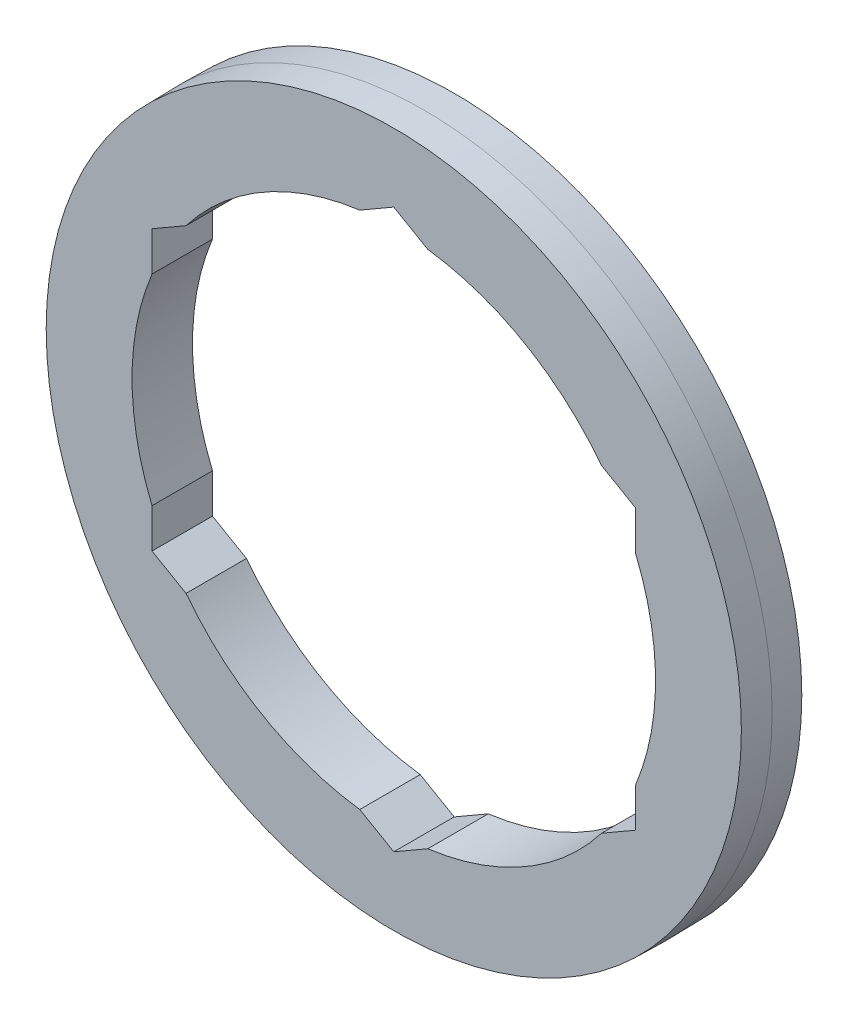
ISO-10303-21;
HEADER;
FILE_DESCRIPTION(('STEP AP214'),'2;1');
FILE_NAME('part.step','',(''),(''),'','','');
FILE_SCHEMA(('AUTOMOTIVE_DESIGN { 1 0 10303 214 1 1 1 1 }'));
ENDSEC;
DATA;
#1=APPLICATION_CONTEXT('core data for automotive mechanical design processes');
#2=APPLICATION_PROTOCOL_DEFINITION('international standard','automotive_design',2000,#1);
#3=PRODUCT_CONTEXT('',#1,'mechanical');
#4=PRODUCT('Part','Part','',(#3));
#5=PRODUCT_RELATED_PRODUCT_CATEGORY('part','',(#4));
#6=PRODUCT_DEFINITION_FORMATION('','',#4);
#7=PRODUCT_DEFINITION_CONTEXT('part definition',#1,'design');
#8=PRODUCT_DEFINITION('design','',#6,#7);
#9=PRODUCT_DEFINITION_SHAPE('','',#8);
#10=(LENGTH_UNIT() NAMED_UNIT(*) SI_UNIT(.MILLI.,.METRE.));
#11=(NAMED_UNIT(*) PLANE_ANGLE_UNIT() SI_UNIT($,.RADIAN.));
#12=(NAMED_UNIT(*) SI_UNIT($,.STERADIAN.) SOLID_ANGLE_UNIT());
#13=UNCERTAINTY_MEASURE_WITH_UNIT(LENGTH_MEASURE(1.E-05),#10,'distance_accuracy_value','');
#14=(GEOMETRIC_REPRESENTATION_CONTEXT(3) GLOBAL_UNCERTAINTY_ASSIGNED_CONTEXT((#13)) GLOBAL_UNIT_ASSIGNED_CONTEXT((#10,
#11,#12)) REPRESENTATION_CONTEXT('',''));
#15=CARTESIAN_POINT('',(0.,0.,0.));
#16=DIRECTION('',(0.,0.,1.));
#17=DIRECTION('',(1.,0.,0.));
#18=AXIS2_PLACEMENT_3D('',#15,#16,#17);
#19=CARTESIAN_POINT('',(0.,0.,-0.79375));
#20=DIRECTION('',(0.,0.,1.));
#21=DIRECTION('',(1.,0.,0.));
#22=AXIS2_PLACEMENT_3D('',#19,#20,#21);
#23=PLANE('',#22);
#24=CARTESIAN_POINT('',(0.,0.,-0.793750000000037));
#25=DIRECTION('',(0.,0.,1.));
#26=DIRECTION('',(1.,0.,0.));
#27=AXIS2_PLACEMENT_3D('',#24,#25,#26);
#28=CIRCLE('',#27,9.13014504221323);
#29=CARTESIAN_POINT('',(9.13014504221323,0.,-0.793750000000037));
#30=VERTEX_POINT('',#29);
#31=EDGE_CURVE('E20',#30,#30,#28,.T.);
#32=ORIENTED_EDGE('',*,*,#31,.F.);
#33=EDGE_LOOP('',(#32));
#34=FACE_BOUND('',#33,.T.);
#35=DIRECTION('',(0.866025403784439,-0.499999999999999,0.));
#36=VECTOR('',#35,1.);
#37=CARTESIAN_POINT('',(0.,7.33234841870825,-0.79375));
#38=LINE('',#37,#36);
#39=CARTESIAN_POINT('',(0.,7.33234841870825,-0.79375));
#40=VERTEX_POINT('',#39);
#41=CARTESIAN_POINT('',(0.893039571032189,6.81675178197583,-0.79375));
#42=VERTEX_POINT('',#41);
#43=EDGE_CURVE('E197',#40,#42,#38,.T.);
#44=ORIENTED_EDGE('',*,*,#43,.F.);
#45=DIRECTION('',(0.866025403784439,0.499999999999999,0.));
#46=VECTOR('',#45,1.);
#47=CARTESIAN_POINT('',(-0.893039571032188,6.81675178197583,-0.79375));
#48=LINE('',#47,#46);
#49=CARTESIAN_POINT('',(-0.89303957103219,6.81675178197583,-0.79375));
#50=VERTEX_POINT('',#49);
#51=EDGE_CURVE('E201',#50,#40,#48,.T.);
#52=ORIENTED_EDGE('',*,*,#51,.F.);
#53=CARTESIAN_POINT('',(0.,0.,-0.79375));
#54=DIRECTION('',(0.,0.,-1.));
#55=DIRECTION('',(-1.,0.,0.));
#56=AXIS2_PLACEMENT_3D('',#53,#54,#55);
#57=CIRCLE('',#56,6.874999966);
#58=CARTESIAN_POINT('',(-5.45696042896781,4.18177084608655,-0.79375));
#59=VERTEX_POINT('',#58);
#60=EDGE_CURVE('E291',#50,#59,#57,.F.);
#61=ORIENTED_EDGE('',*,*,#60,.T.);
#62=DIRECTION('',(0.866025403784439,0.5,0.));
#63=VECTOR('',#62,1.);
#64=CARTESIAN_POINT('',(-3.175,5.49926131403119,-0.79375));
#65=LINE('',#64,#63);
#66=CARTESIAN_POINT('',(-6.35,3.66617420935413,-0.79375));
#67=VERTEX_POINT('',#66);
#68=EDGE_CURVE('E208',#67,#59,#65,.T.);
#69=ORIENTED_EDGE('',*,*,#68,.F.);
#70=DIRECTION('',(0.,1.,0.));
#71=VECTOR('',#70,1.);
#72=CARTESIAN_POINT('',(-6.35,0.,-0.79375));
#73=LINE('',#72,#71);
#74=CARTESIAN_POINT('',(-6.35,2.63498093588928,-0.79375));
#75=VERTEX_POINT('',#74);
#76=EDGE_CURVE('E214',#75,#67,#73,.T.);
#77=ORIENTED_EDGE('',*,*,#76,.F.);
#78=CARTESIAN_POINT('',(0.,0.,-0.79375));
#79=DIRECTION('',(0.,0.,-1.));
#80=DIRECTION('',(-1.,0.,0.));
#81=AXIS2_PLACEMENT_3D('',#78,#79,#80);
#82=CIRCLE('',#81,6.874999966);
#83=CARTESIAN_POINT('',(-6.35,-2.63498093588928,-0.79375));
#84=VERTEX_POINT('',#83);
#85=EDGE_CURVE('E217',#75,#84,#82,.F.);
#86=ORIENTED_EDGE('',*,*,#85,.T.);
#87=DIRECTION('',(0.,1.,0.));
#88=VECTOR('',#87,1.);
#89=CARTESIAN_POINT('',(-6.35,0.,-0.79375));
#90=LINE('',#89,#88);
#91=CARTESIAN_POINT('',(-6.35,-3.66617420935412,-0.79375));
#92=VERTEX_POINT('',#91);
#93=EDGE_CURVE('E220',#92,#84,#90,.T.);
#94=ORIENTED_EDGE('',*,*,#93,.F.);
#95=DIRECTION('',(-0.866025403784439,0.5,0.));
#96=VECTOR('',#95,1.);
#97=CARTESIAN_POINT('',(-3.175,-5.49926131403119,-0.79375));
#98=LINE('',#97,#96);
#99=CARTESIAN_POINT('',(-5.45696042896782,-4.18177084608654,-0.79375));
#100=VERTEX_POINT('',#99);
#101=EDGE_CURVE('E227',#100,#92,#98,.T.);
#102=ORIENTED_EDGE('',*,*,#101,.F.);
#103=CARTESIAN_POINT('',(0.,0.,-0.79375));
#104=DIRECTION('',(0.,0.,-1.));
#105=DIRECTION('',(-1.,0.,0.));
#106=AXIS2_PLACEMENT_3D('',#103,#104,#105);
#107=CIRCLE('',#106,6.874999966);
#108=CARTESIAN_POINT('',(-0.893039571032187,-6.81675178197583,-0.79375));
#109=VERTEX_POINT('',#108);
#110=EDGE_CURVE('E230',#100,#109,#107,.F.);
#111=ORIENTED_EDGE('',*,*,#110,.T.);
#112=DIRECTION('',(-0.866025403784439,0.5,0.));
#113=VECTOR('',#112,1.);
#114=CARTESIAN_POINT('',(-3.175,-5.49926131403119,-0.79375));
#115=LINE('',#114,#113);
#116=CARTESIAN_POINT('',(0.,-7.33234841870825,-0.79375));
#117=VERTEX_POINT('',#116);
#118=EDGE_CURVE('E233',#117,#109,#115,.T.);
#119=ORIENTED_EDGE('',*,*,#118,.F.);
#120=DIRECTION('',(-0.866025403784439,-0.5,0.));
#121=VECTOR('',#120,1.);
#122=CARTESIAN_POINT('',(3.175,-5.49926131403119,-0.793750000000001));
#123=LINE('',#122,#121);
#124=CARTESIAN_POINT('',(0.893039571032181,-6.81675178197583,-0.793750000000001));
#125=VERTEX_POINT('',#124);
#126=EDGE_CURVE('E239',#125,#117,#123,.T.);
#127=ORIENTED_EDGE('',*,*,#126,.F.);
#128=CARTESIAN_POINT('',(0.,0.,-0.79375));
#129=DIRECTION('',(0.,0.,-1.));
#130=DIRECTION('',(-1.,0.,0.));
#131=AXIS2_PLACEMENT_3D('',#128,#129,#130);
#132=CIRCLE('',#131,6.874999966);
#133=CARTESIAN_POINT('',(5.45696042896782,-4.18177084608654,-0.79375));
#134=VERTEX_POINT('',#133);
#135=EDGE_CURVE('E242',#125,#134,#132,.F.);
#136=ORIENTED_EDGE('',*,*,#135,.T.);
#137=DIRECTION('',(-0.866025403784439,-0.5,0.));
#138=VECTOR('',#137,1.);
#139=CARTESIAN_POINT('',(3.175,-5.49926131403119,-0.793750000000001));
#140=LINE('',#139,#138);
#141=CARTESIAN_POINT('',(6.35,-3.66617420935413,-0.793750000000001));
#142=VERTEX_POINT('',#141);
#143=EDGE_CURVE('E245',#142,#134,#140,.T.);
#144=ORIENTED_EDGE('',*,*,#143,.F.);
#145=DIRECTION('',(0.,-1.,0.));
#146=VECTOR('',#145,1.);
#147=CARTESIAN_POINT('',(6.35,0.,-0.79375));
#148=LINE('',#147,#146);
#149=CARTESIAN_POINT('',(6.35,-2.6349809358893,-0.79375));
#150=VERTEX_POINT('',#149);
#151=EDGE_CURVE('E252',#150,#142,#148,.T.);
#152=ORIENTED_EDGE('',*,*,#151,.F.);
#153=CARTESIAN_POINT('',(0.,0.,-0.79375));
#154=DIRECTION('',(0.,0.,-1.));
#155=DIRECTION('',(-1.,0.,0.));
#156=AXIS2_PLACEMENT_3D('',#153,#154,#155);
#157=CIRCLE('',#156,6.874999966);
#158=CARTESIAN_POINT('',(6.35,2.6349809358893,-0.79375));
#159=VERTEX_POINT('',#158);
#160=EDGE_CURVE('E256',#150,#159,#157,.F.);
#161=ORIENTED_EDGE('',*,*,#160,.T.);
#162=DIRECTION('',(0.,-1.,0.));
#163=VECTOR('',#162,1.);
#164=CARTESIAN_POINT('',(6.35,0.,-0.79375));
#165=LINE('',#164,#163);
#166=CARTESIAN_POINT('',(6.35,3.66617420935413,-0.79375));
#167=VERTEX_POINT('',#166);
#168=EDGE_CURVE('E164',#167,#159,#165,.T.);
#169=ORIENTED_EDGE('',*,*,#168,.F.);
#170=DIRECTION('',(0.866025403784439,-0.5,0.));
#171=VECTOR('',#170,1.);
#172=CARTESIAN_POINT('',(3.175,5.49926131403119,-0.79375));
#173=LINE('',#172,#171);
#174=CARTESIAN_POINT('',(5.45696042896782,4.18177084608655,-0.79375));
#175=VERTEX_POINT('',#174);
#176=EDGE_CURVE('E158',#175,#167,#173,.T.);
#177=ORIENTED_EDGE('',*,*,#176,.F.);
#178=CARTESIAN_POINT('',(0.,0.,-0.79375));
#179=DIRECTION('',(0.,0.,-1.));
#180=DIRECTION('',(-1.,0.,0.));
#181=AXIS2_PLACEMENT_3D('',#178,#179,#180);
#182=CIRCLE('',#181,6.874999966);
#183=EDGE_CURVE('E161',#175,#42,#182,.F.);
#184=ORIENTED_EDGE('',*,*,#183,.T.);
#185=EDGE_LOOP('',(#44,#52,#61,#69,#77,#86,#94,#102,#111,#119,#127,#136,#144,#152,#161,#169,
#177,#184));
#186=FACE_BOUND('',#185,.T.);
#187=ADVANCED_FACE('F17',(#34,#186),#23,.F.);
#188=CARTESIAN_POINT('',(0.,0.,0.));
#189=DIRECTION('',(0.,0.,1.));
#190=DIRECTION('',(1.,0.,0.));
#191=AXIS2_PLACEMENT_3D('',#188,#189,#190);
#192=CONICAL_SURFACE('',#191,9.144,0.0174532925199435);
#193=CARTESIAN_POINT('',(0.,0.,0.));
#194=DIRECTION('',(0.,0.,-1.));
#195=DIRECTION('',(1.,0.,0.));
#196=AXIS2_PLACEMENT_3D('',#193,#194,#195);
#197=CIRCLE('',#196,9.144);
#198=CARTESIAN_POINT('',(9.144,0.,0.));
#199=VERTEX_POINT('',#198);
#200=EDGE_CURVE('E192',#199,#199,#197,.F.);
#201=ORIENTED_EDGE('',*,*,#200,.F.);
#202=EDGE_LOOP('',(#201));
#203=FACE_BOUND('',#202,.T.);
#204=ORIENTED_EDGE('',*,*,#31,.T.);
#205=EDGE_LOOP('',(#204));
#206=FACE_BOUND('',#205,.T.);
#207=ADVANCED_FACE('F583',(#203,#206),#192,.T.);
#208=CARTESIAN_POINT('',(0.,0.,0.79375));
#209=DIRECTION('',(0.,0.,-1.));
#210=DIRECTION('',(-1.,0.,0.));
#211=AXIS2_PLACEMENT_3D('',#208,#209,#210);
#212=CYLINDRICAL_SURFACE('',#211,6.874999966);
#213=DIRECTION('',(0.,0.,1.));
#214=VECTOR('',#213,1.);
#215=CARTESIAN_POINT('',(5.45696042896781,4.18177084608655,0.79375));
#216=LINE('',#215,#214);
#217=CARTESIAN_POINT('',(5.45696042896781,4.18177084608655,0.79375));
#218=VERTEX_POINT('',#217);
#219=EDGE_CURVE('E169',#218,#175,#216,.F.);
#220=ORIENTED_EDGE('',*,*,#219,.F.);
#221=CARTESIAN_POINT('',(0.,0.,0.79375));
#222=DIRECTION('',(0.,0.,-1.));
#223=DIRECTION('',(-1.,0.,0.));
#224=AXIS2_PLACEMENT_3D('',#221,#222,#223);
#225=CIRCLE('',#224,6.874999966);
#226=CARTESIAN_POINT('',(0.893039571032189,6.81675178197583,0.79375));
#227=VERTEX_POINT('',#226);
#228=EDGE_CURVE('E196',#227,#218,#225,.T.);
#229=ORIENTED_EDGE('',*,*,#228,.F.);
#230=DIRECTION('',(0.,0.,1.));
#231=VECTOR('',#230,1.);
#232=CARTESIAN_POINT('',(0.893039571032188,6.81675178197583,0.79375));
#233=LINE('',#232,#231);
#234=EDGE_CURVE('E175',#42,#227,#233,.T.);
#235=ORIENTED_EDGE('',*,*,#234,.F.);
#236=ORIENTED_EDGE('',*,*,#183,.F.);
#237=EDGE_LOOP('',(#220,#229,#235,#236));
#238=FACE_BOUND('',#237,.T.);
#239=ADVANCED_FACE('F172',(#238),#212,.F.);
#240=CARTESIAN_POINT('',(3.175,5.49926131403119,0.79375));
#241=DIRECTION('',(-0.5,-0.866025403784439,0.));
#242=DIRECTION('',(0.866025403784439,-0.5,0.));
#243=AXIS2_PLACEMENT_3D('',#240,#241,#242);
#244=PLANE('',#243);
#245=DIRECTION('',(0.866025403784438,-0.500000000000002,0.));
#246=VECTOR('',#245,1.);
#247=CARTESIAN_POINT('',(5.45696042896782,4.18177084608655,0.79375));
#248=LINE('',#247,#246);
#249=CARTESIAN_POINT('',(6.35,3.66617420935413,0.79375));
#250=VERTEX_POINT('',#249);
#251=EDGE_CURVE('E179',#218,#250,#248,.T.);
#252=ORIENTED_EDGE('',*,*,#251,.F.);
#253=ORIENTED_EDGE('',*,*,#219,.T.);
#254=ORIENTED_EDGE('',*,*,#176,.T.);
#255=DIRECTION('',(0.,0.,1.));
#256=VECTOR('',#255,1.);
#257=CARTESIAN_POINT('',(6.35,3.66617420935413,0.79375));
#258=LINE('',#257,#256);
#259=EDGE_CURVE('E186',#250,#167,#258,.F.);
#260=ORIENTED_EDGE('',*,*,#259,.F.);
#261=EDGE_LOOP('',(#252,#253,#254,#260));
#262=FACE_BOUND('',#261,.T.);
#263=ADVANCED_FACE('F177',(#262),#244,.T.);
#264=CARTESIAN_POINT('',(6.35,0.,0.79375));
#265=DIRECTION('',(-1.,0.,0.));
#266=DIRECTION('',(0.,-1.,0.));
#267=AXIS2_PLACEMENT_3D('',#264,#265,#266);
#268=PLANE('',#267);
#269=DIRECTION('',(0.,1.,0.));
#270=VECTOR('',#269,1.);
#271=CARTESIAN_POINT('',(6.35,0.,0.79375));
#272=LINE('',#271,#270);
#273=CARTESIAN_POINT('',(6.35,2.6349809358893,0.79375));
#274=VERTEX_POINT('',#273);
#275=EDGE_CURVE('E289',#250,#274,#272,.F.);
#276=ORIENTED_EDGE('',*,*,#275,.F.);
#277=ORIENTED_EDGE('',*,*,#259,.T.);
#278=ORIENTED_EDGE('',*,*,#168,.T.);
#279=DIRECTION('',(0.,0.,-1.));
#280=VECTOR('',#279,1.);
#281=CARTESIAN_POINT('',(6.35,2.6349809358893,0.79375));
#282=LINE('',#281,#280);
#283=EDGE_CURVE('E307',#159,#274,#282,.F.);
#284=ORIENTED_EDGE('',*,*,#283,.T.);
#285=EDGE_LOOP('',(#276,#277,#278,#284));
#286=FACE_BOUND('',#285,.T.);
#287=ADVANCED_FACE('F463',(#286),#268,.T.);
#288=CARTESIAN_POINT('',(0.,0.,0.79375));
#289=DIRECTION('',(0.,0.,-1.));
#290=DIRECTION('',(-1.,0.,0.));
#291=AXIS2_PLACEMENT_3D('',#288,#289,#290);
#292=CYLINDRICAL_SURFACE('',#291,6.874999966);
#293=DIRECTION('',(0.,0.,1.));
#294=VECTOR('',#293,1.);
#295=CARTESIAN_POINT('',(6.35,-2.6349809358893,0.79375));
#296=LINE('',#295,#294);
#297=CARTESIAN_POINT('',(6.35,-2.6349809358893,0.79375));
#298=VERTEX_POINT('',#297);
#299=EDGE_CURVE('E249',#298,#150,#296,.F.);
#300=ORIENTED_EDGE('',*,*,#299,.F.);
#301=CARTESIAN_POINT('',(0.,0.,0.79375));
#302=DIRECTION('',(0.,0.,-1.));
#303=DIRECTION('',(-1.,0.,0.));
#304=AXIS2_PLACEMENT_3D('',#301,#302,#303);
#305=CIRCLE('',#304,6.874999966);
#306=EDGE_CURVE('E284',#274,#298,#305,.T.);
#307=ORIENTED_EDGE('',*,*,#306,.F.);
#308=ORIENTED_EDGE('',*,*,#283,.F.);
#309=ORIENTED_EDGE('',*,*,#160,.F.);
#310=EDGE_LOOP('',(#300,#307,#308,#309));
#311=FACE_BOUND('',#310,.T.);
#312=ADVANCED_FACE('F461',(#311),#292,.F.);
#313=CARTESIAN_POINT('',(6.35,0.,0.79375));
#314=DIRECTION('',(-1.,0.,0.));
#315=DIRECTION('',(0.,-1.,0.));
#316=AXIS2_PLACEMENT_3D('',#313,#314,#315);
#317=PLANE('',#316);
#318=DIRECTION('',(0.,1.,0.));
#319=VECTOR('',#318,1.);
#320=CARTESIAN_POINT('',(6.35,0.,0.79375));
#321=LINE('',#320,#319);
#322=CARTESIAN_POINT('',(6.35,-3.66617420935413,0.79375));
#323=VERTEX_POINT('',#322);
#324=EDGE_CURVE('E288',#298,#323,#321,.F.);
#325=ORIENTED_EDGE('',*,*,#324,.F.);
#326=ORIENTED_EDGE('',*,*,#299,.T.);
#327=ORIENTED_EDGE('',*,*,#151,.T.);
#328=DIRECTION('',(0.,0.,1.));
#329=VECTOR('',#328,1.);
#330=CARTESIAN_POINT('',(6.35,-3.66617420935413,0.79375));
#331=LINE('',#330,#329);
#332=EDGE_CURVE('E248',#323,#142,#331,.F.);
#333=ORIENTED_EDGE('',*,*,#332,.F.);
#334=EDGE_LOOP('',(#325,#326,#327,#333));
#335=FACE_BOUND('',#334,.T.);
#336=ADVANCED_FACE('F457',(#335),#317,.T.);
#337=CARTESIAN_POINT('',(3.175,-5.49926131403119,0.79375));
#338=DIRECTION('',(-0.5,0.866025403784439,0.));
#339=DIRECTION('',(-0.866025403784439,-0.5,0.));
#340=AXIS2_PLACEMENT_3D('',#337,#338,#339);
#341=PLANE('',#340);
#342=DIRECTION('',(-0.866025403784438,-0.500000000000001,0.));
#343=VECTOR('',#342,1.);
#344=CARTESIAN_POINT('',(6.35,-3.66617420935413,0.79375));
#345=LINE('',#344,#343);
#346=CARTESIAN_POINT('',(5.45696042896782,-4.18177084608654,0.79375));
#347=VERTEX_POINT('',#346);
#348=EDGE_CURVE('E283',#323,#347,#345,.T.);
#349=ORIENTED_EDGE('',*,*,#348,.F.);
#350=ORIENTED_EDGE('',*,*,#332,.T.);
#351=ORIENTED_EDGE('',*,*,#143,.T.);
#352=DIRECTION('',(0.,0.,-1.));
#353=VECTOR('',#352,1.);
#354=CARTESIAN_POINT('',(5.45696042896782,-4.18177084608654,0.79375));
#355=LINE('',#354,#353);
#356=EDGE_CURVE('E305',#134,#347,#355,.F.);
#357=ORIENTED_EDGE('',*,*,#356,.T.);
#358=EDGE_LOOP('',(#349,#350,#351,#357));
#359=FACE_BOUND('',#358,.T.);
#360=ADVANCED_FACE('F459',(#359),#341,.T.);
#361=CARTESIAN_POINT('',(0.,0.,0.79375));
#362=DIRECTION('',(0.,0.,-1.));
#363=DIRECTION('',(-1.,0.,0.));
#364=AXIS2_PLACEMENT_3D('',#361,#362,#363);
#365=CYLINDRICAL_SURFACE('',#364,6.874999966);
#366=DIRECTION('',(0.,0.,1.));
#367=VECTOR('',#366,1.);
#368=CARTESIAN_POINT('',(0.89303957103218,-6.81675178197583,0.79375));
#369=LINE('',#368,#367);
#370=CARTESIAN_POINT('',(0.89303957103218,-6.81675178197583,0.79375));
#371=VERTEX_POINT('',#370);
#372=EDGE_CURVE('E236',#371,#125,#369,.F.);
#373=ORIENTED_EDGE('',*,*,#372,.F.);
#374=CARTESIAN_POINT('',(0.,0.,0.79375));
#375=DIRECTION('',(0.,0.,-1.));
#376=DIRECTION('',(-1.,0.,0.));
#377=AXIS2_PLACEMENT_3D('',#374,#375,#376);
#378=CIRCLE('',#377,6.874999966);
#379=EDGE_CURVE('E278',#347,#371,#378,.T.);
#380=ORIENTED_EDGE('',*,*,#379,.F.);
#381=ORIENTED_EDGE('',*,*,#356,.F.);
#382=ORIENTED_EDGE('',*,*,#135,.F.);
#383=EDGE_LOOP('',(#373,#380,#381,#382));
#384=FACE_BOUND('',#383,.T.);
#385=ADVANCED_FACE('F452',(#384),#365,.F.);
#386=CARTESIAN_POINT('',(3.175,-5.49926131403119,0.79375));
#387=DIRECTION('',(-0.5,0.866025403784439,0.));
#388=DIRECTION('',(-0.866025403784439,-0.5,0.));
#389=AXIS2_PLACEMENT_3D('',#386,#387,#388);
#390=PLANE('',#389);
#391=DIRECTION('',(-0.866025403784439,-0.499999999999998,0.));
#392=VECTOR('',#391,1.);
#393=CARTESIAN_POINT('',(0.893039571032181,-6.81675178197583,0.79375));
#394=LINE('',#393,#392);
#395=CARTESIAN_POINT('',(0.,-7.33234841870825,0.79375));
#396=VERTEX_POINT('',#395);
#397=EDGE_CURVE('E282',#371,#396,#394,.T.);
#398=ORIENTED_EDGE('',*,*,#397,.F.);
#399=ORIENTED_EDGE('',*,*,#372,.T.);
#400=ORIENTED_EDGE('',*,*,#126,.T.);
#401=DIRECTION('',(0.,0.,1.));
#402=VECTOR('',#401,1.);
#403=CARTESIAN_POINT('',(0.,-7.33234841870825,0.79375));
#404=LINE('',#403,#402);
#405=EDGE_CURVE('E235',#396,#117,#404,.F.);
#406=ORIENTED_EDGE('',*,*,#405,.F.);
#407=EDGE_LOOP('',(#398,#399,#400,#406));
#408=FACE_BOUND('',#407,.T.);
#409=ADVANCED_FACE('F449',(#408),#390,.T.);
#410=CARTESIAN_POINT('',(-3.175,-5.49926131403119,0.79375));
#411=DIRECTION('',(0.5,0.866025403784439,0.));
#412=DIRECTION('',(-0.866025403784439,0.5,0.));
#413=AXIS2_PLACEMENT_3D('',#410,#411,#412);
#414=PLANE('',#413);
#415=DIRECTION('',(-0.86602540378444,0.499999999999998,0.));
#416=VECTOR('',#415,1.);
#417=CARTESIAN_POINT('',(0.,-7.33234841870825,0.79375));
#418=LINE('',#417,#416);
#419=CARTESIAN_POINT('',(-0.893039571032187,-6.81675178197583,0.79375));
#420=VERTEX_POINT('',#419);
#421=EDGE_CURVE('E277',#396,#420,#418,.T.);
#422=ORIENTED_EDGE('',*,*,#421,.F.);
#423=ORIENTED_EDGE('',*,*,#405,.T.);
#424=ORIENTED_EDGE('',*,*,#118,.T.);
#425=DIRECTION('',(0.,0.,-1.));
#426=VECTOR('',#425,1.);
#427=CARTESIAN_POINT('',(-0.893039571032188,-6.81675178197583,0.79375));
#428=LINE('',#427,#426);
#429=EDGE_CURVE('E301',#109,#420,#428,.F.);
#430=ORIENTED_EDGE('',*,*,#429,.T.);
#431=EDGE_LOOP('',(#422,#423,#424,#430));
#432=FACE_BOUND('',#431,.T.);
#433=ADVANCED_FACE('F445',(#432),#414,.T.);
#434=CARTESIAN_POINT('',(0.,0.,0.79375));
#435=DIRECTION('',(0.,0.,-1.));
#436=DIRECTION('',(-1.,0.,0.));
#437=AXIS2_PLACEMENT_3D('',#434,#435,#436);
#438=CYLINDRICAL_SURFACE('',#437,6.874999966);
#439=DIRECTION('',(0.,0.,1.));
#440=VECTOR('',#439,1.);
#441=CARTESIAN_POINT('',(-5.45696042896782,-4.18177084608654,0.79375));
#442=LINE('',#441,#440);
#443=CARTESIAN_POINT('',(-5.45696042896782,-4.18177084608654,0.79375));
#444=VERTEX_POINT('',#443);
#445=EDGE_CURVE('E224',#444,#100,#442,.F.);
#446=ORIENTED_EDGE('',*,*,#445,.F.);
#447=CARTESIAN_POINT('',(0.,0.,0.79375));
#448=DIRECTION('',(0.,0.,-1.));
#449=DIRECTION('',(-1.,0.,0.));
#450=AXIS2_PLACEMENT_3D('',#447,#448,#449);
#451=CIRCLE('',#450,6.874999966);
#452=EDGE_CURVE('E273',#420,#444,#451,.T.);
#453=ORIENTED_EDGE('',*,*,#452,.F.);
#454=ORIENTED_EDGE('',*,*,#429,.F.);
#455=ORIENTED_EDGE('',*,*,#110,.F.);
#456=EDGE_LOOP('',(#446,#453,#454,#455));
#457=FACE_BOUND('',#456,.T.);
#458=ADVANCED_FACE('F441',(#457),#438,.F.);
#459=CARTESIAN_POINT('',(-3.175,-5.49926131403119,0.79375));
#460=DIRECTION('',(0.5,0.866025403784439,0.));
#461=DIRECTION('',(-0.866025403784439,0.5,0.));
#462=AXIS2_PLACEMENT_3D('',#459,#460,#461);
#463=PLANE('',#462);
#464=DIRECTION('',(-0.866025403784437,0.500000000000002,0.));
#465=VECTOR('',#464,1.);
#466=CARTESIAN_POINT('',(-5.45696042896782,-4.18177084608655,0.79375));
#467=LINE('',#466,#465);
#468=CARTESIAN_POINT('',(-6.35,-3.66617420935412,0.79375));
#469=VERTEX_POINT('',#468);
#470=EDGE_CURVE('E276',#444,#469,#467,.T.);
#471=ORIENTED_EDGE('',*,*,#470,.F.);
#472=ORIENTED_EDGE('',*,*,#445,.T.);
#473=ORIENTED_EDGE('',*,*,#101,.T.);
#474=DIRECTION('',(0.,0.,1.));
#475=VECTOR('',#474,1.);
#476=CARTESIAN_POINT('',(-6.35,-3.66617420935412,0.79375));
#477=LINE('',#476,#475);
#478=EDGE_CURVE('E223',#469,#92,#477,.F.);
#479=ORIENTED_EDGE('',*,*,#478,.F.);
#480=EDGE_LOOP('',(#471,#472,#473,#479));
#481=FACE_BOUND('',#480,.T.);
#482=ADVANCED_FACE('F437',(#481),#463,.T.);
#483=CARTESIAN_POINT('',(-6.35,0.,0.79375));
#484=DIRECTION('',(1.,0.,0.));
#485=DIRECTION('',(0.,1.,0.));
#486=AXIS2_PLACEMENT_3D('',#483,#484,#485);
#487=PLANE('',#486);
#488=DIRECTION('',(0.,1.,0.));
#489=VECTOR('',#488,1.);
#490=CARTESIAN_POINT('',(-6.35,0.,0.79375));
#491=LINE('',#490,#489);
#492=CARTESIAN_POINT('',(-6.35,-2.63498093588928,0.79375));
#493=VERTEX_POINT('',#492);
#494=EDGE_CURVE('E272',#469,#493,#491,.T.);
#495=ORIENTED_EDGE('',*,*,#494,.F.);
#496=ORIENTED_EDGE('',*,*,#478,.T.);
#497=ORIENTED_EDGE('',*,*,#93,.T.);
#498=DIRECTION('',(0.,0.,-1.));
#499=VECTOR('',#498,1.);
#500=CARTESIAN_POINT('',(-6.35,-2.63498093588928,0.79375));
#501=LINE('',#500,#499);
#502=EDGE_CURVE('E298',#84,#493,#501,.F.);
#503=ORIENTED_EDGE('',*,*,#502,.T.);
#504=EDGE_LOOP('',(#495,#496,#497,#503));
#505=FACE_BOUND('',#504,.T.);
#506=ADVANCED_FACE('F434',(#505),#487,.T.);
#507=CARTESIAN_POINT('',(0.,0.,0.79375));
#508=DIRECTION('',(0.,0.,-1.));
#509=DIRECTION('',(-1.,0.,0.));
#510=AXIS2_PLACEMENT_3D('',#507,#508,#509);
#511=CYLINDRICAL_SURFACE('',#510,6.874999966);
#512=DIRECTION('',(0.,0.,1.));
#513=VECTOR('',#512,1.);
#514=CARTESIAN_POINT('',(-6.35,2.63498093588928,0.79375));
#515=LINE('',#514,#513);
#516=CARTESIAN_POINT('',(-6.35,2.63498093588928,0.79375));
#517=VERTEX_POINT('',#516);
#518=EDGE_CURVE('E211',#517,#75,#515,.F.);
#519=ORIENTED_EDGE('',*,*,#518,.F.);
#520=CARTESIAN_POINT('',(0.,0.,0.79375));
#521=DIRECTION('',(0.,0.,-1.));
#522=DIRECTION('',(-1.,0.,0.));
#523=AXIS2_PLACEMENT_3D('',#520,#521,#522);
#524=CIRCLE('',#523,6.874999966);
#525=EDGE_CURVE('E269',#493,#517,#524,.T.);
#526=ORIENTED_EDGE('',*,*,#525,.F.);
#527=ORIENTED_EDGE('',*,*,#502,.F.);
#528=ORIENTED_EDGE('',*,*,#85,.F.);
#529=EDGE_LOOP('',(#519,#526,#527,#528));
#530=FACE_BOUND('',#529,.T.);
#531=ADVANCED_FACE('F430',(#530),#511,.F.);
#532=CARTESIAN_POINT('',(-6.35,0.,0.79375));
#533=DIRECTION('',(1.,0.,0.));
#534=DIRECTION('',(0.,1.,0.));
#535=AXIS2_PLACEMENT_3D('',#532,#533,#534);
#536=PLANE('',#535);
#537=DIRECTION('',(0.,1.,0.));
#538=VECTOR('',#537,1.);
#539=CARTESIAN_POINT('',(-6.35,0.,0.79375));
#540=LINE('',#539,#538);
#541=CARTESIAN_POINT('',(-6.35,3.66617420935413,0.79375));
#542=VERTEX_POINT('',#541);
#543=EDGE_CURVE('E271',#517,#542,#540,.T.);
#544=ORIENTED_EDGE('',*,*,#543,.F.);
#545=ORIENTED_EDGE('',*,*,#518,.T.);
#546=ORIENTED_EDGE('',*,*,#76,.T.);
#547=DIRECTION('',(0.,0.,1.));
#548=VECTOR('',#547,1.);
#549=CARTESIAN_POINT('',(-6.35,3.66617420935413,0.79375));
#550=LINE('',#549,#548);
#551=EDGE_CURVE('E210',#542,#67,#550,.F.);
#552=ORIENTED_EDGE('',*,*,#551,.F.);
#553=EDGE_LOOP('',(#544,#545,#546,#552));
#554=FACE_BOUND('',#553,.T.);
#555=ADVANCED_FACE('F426',(#554),#536,.T.);
#556=CARTESIAN_POINT('',(-3.175,5.49926131403119,0.79375));
#557=DIRECTION('',(0.5,-0.866025403784439,0.));
#558=DIRECTION('',(0.866025403784439,0.5,0.));
#559=AXIS2_PLACEMENT_3D('',#556,#557,#558);
#560=PLANE('',#559);
#561=DIRECTION('',(0.866025403784438,0.5,0.));
#562=VECTOR('',#561,1.);
#563=CARTESIAN_POINT('',(-6.35,3.66617420935413,0.79375));
#564=LINE('',#563,#562);
#565=CARTESIAN_POINT('',(-5.45696042896781,4.18177084608655,0.79375));
#566=VERTEX_POINT('',#565);
#567=EDGE_CURVE('E268',#542,#566,#564,.T.);
#568=ORIENTED_EDGE('',*,*,#567,.F.);
#569=ORIENTED_EDGE('',*,*,#551,.T.);
#570=ORIENTED_EDGE('',*,*,#68,.T.);
#571=DIRECTION('',(0.,0.,-1.));
#572=VECTOR('',#571,1.);
#573=CARTESIAN_POINT('',(-5.45696042896781,4.18177084608655,0.79375));
#574=LINE('',#573,#572);
#575=EDGE_CURVE('E296',#59,#566,#574,.F.);
#576=ORIENTED_EDGE('',*,*,#575,.T.);
#577=EDGE_LOOP('',(#568,#569,#570,#576));
#578=FACE_BOUND('',#577,.T.);
#579=ADVANCED_FACE('F423',(#578),#560,.T.);
#580=CARTESIAN_POINT('',(0.,0.,0.79375));
#581=DIRECTION('',(0.,0.,-1.));
#582=DIRECTION('',(-1.,0.,0.));
#583=AXIS2_PLACEMENT_3D('',#580,#581,#582);
#584=CYLINDRICAL_SURFACE('',#583,6.874999966);
#585=DIRECTION('',(0.,0.,1.));
#586=VECTOR('',#585,1.);
#587=CARTESIAN_POINT('',(-0.893039571032189,6.81675178197583,0.79375));
#588=LINE('',#587,#586);
#589=CARTESIAN_POINT('',(-0.89303957103219,6.81675178197583,0.79375));
#590=VERTEX_POINT('',#589);
#591=EDGE_CURVE('E295',#590,#50,#588,.F.);
#592=ORIENTED_EDGE('',*,*,#591,.F.);
#593=CARTESIAN_POINT('',(0.,0.,0.79375));
#594=DIRECTION('',(0.,0.,-1.));
#595=DIRECTION('',(-1.,0.,0.));
#596=AXIS2_PLACEMENT_3D('',#593,#594,#595);
#597=CIRCLE('',#596,6.874999966);
#598=EDGE_CURVE('E263',#566,#590,#597,.T.);
#599=ORIENTED_EDGE('',*,*,#598,.F.);
#600=ORIENTED_EDGE('',*,*,#575,.F.);
#601=ORIENTED_EDGE('',*,*,#60,.F.);
#602=EDGE_LOOP('',(#592,#599,#600,#601));
#603=FACE_BOUND('',#602,.T.);
#604=ADVANCED_FACE('F417',(#603),#584,.F.);
#605=CARTESIAN_POINT('',(-3.175,5.49926131403119,0.79375));
#606=DIRECTION('',(0.5,-0.866025403784439,0.));
#607=DIRECTION('',(0.866025403784439,0.5,0.));
#608=AXIS2_PLACEMENT_3D('',#605,#606,#607);
#609=PLANE('',#608);
#610=DIRECTION('',(0.866025403784439,0.499999999999999,0.));
#611=VECTOR('',#610,1.);
#612=CARTESIAN_POINT('',(-0.893039571032188,6.81675178197583,0.79375));
#613=LINE('',#612,#611);
#614=CARTESIAN_POINT('',(0.,7.33234841870825,0.79375));
#615=VERTEX_POINT('',#614);
#616=EDGE_CURVE('E267',#590,#615,#613,.T.);
#617=ORIENTED_EDGE('',*,*,#616,.F.);
#618=ORIENTED_EDGE('',*,*,#591,.T.);
#619=ORIENTED_EDGE('',*,*,#51,.T.);
#620=DIRECTION('',(0.,0.,1.));
#621=VECTOR('',#620,1.);
#622=CARTESIAN_POINT('',(0.,7.33234841870825,0.79375));
#623=LINE('',#622,#621);
#624=EDGE_CURVE('E40',#615,#40,#623,.F.);
#625=ORIENTED_EDGE('',*,*,#624,.F.);
#626=EDGE_LOOP('',(#617,#618,#619,#625));
#627=FACE_BOUND('',#626,.T.);
#628=ADVANCED_FACE('F419',(#627),#609,.T.);
#629=CARTESIAN_POINT('',(3.175,5.49926131403119,0.79375));
#630=DIRECTION('',(-0.5,-0.866025403784439,0.));
#631=DIRECTION('',(0.866025403784439,-0.5,0.));
#632=AXIS2_PLACEMENT_3D('',#629,#630,#631);
#633=PLANE('',#632);
#634=DIRECTION('',(0.866025403784439,-0.499999999999999,0.));
#635=VECTOR('',#634,1.);
#636=CARTESIAN_POINT('',(0.,7.33234841870825,0.79375));
#637=LINE('',#636,#635);
#638=EDGE_CURVE('E27',#615,#227,#637,.T.);
#639=ORIENTED_EDGE('',*,*,#638,.F.);
#640=ORIENTED_EDGE('',*,*,#624,.T.);
#641=ORIENTED_EDGE('',*,*,#43,.T.);
#642=ORIENTED_EDGE('',*,*,#234,.T.);
#643=EDGE_LOOP('',(#639,#640,#641,#642));
#644=FACE_BOUND('',#643,.T.);
#645=ADVANCED_FACE('F412',(#644),#633,.T.);
#646=CARTESIAN_POINT('',(0.,0.,0.));
#647=DIRECTION('',(0.,0.,-1.));
#648=DIRECTION('',(-1.,0.,0.));
#649=AXIS2_PLACEMENT_3D('',#646,#647,#648);
#650=CONICAL_SURFACE('',#649,9.144,0.0174532925199435);
#651=ORIENTED_EDGE('',*,*,#200,.T.);
#652=EDGE_LOOP('',(#651));
#653=FACE_BOUND('',#652,.T.);
#654=CARTESIAN_POINT('',(0.,0.,0.793750000000037));
#655=DIRECTION('',(0.,0.,-1.));
#656=DIRECTION('',(-1.,0.,0.));
#657=AXIS2_PLACEMENT_3D('',#654,#655,#656);
#658=CIRCLE('',#657,9.13014504221323);
#659=CARTESIAN_POINT('',(-9.13014504221323,0.,0.793750000000037));
#660=VERTEX_POINT('',#659);
#661=EDGE_CURVE('E11',#660,#660,#658,.F.);
#662=ORIENTED_EDGE('',*,*,#661,.F.);
#663=EDGE_LOOP('',(#662));
#664=FACE_BOUND('',#663,.T.);
#665=ADVANCED_FACE('F473',(#653,#664),#650,.T.);
#666=CARTESIAN_POINT('',(0.,0.,0.79375));
#667=DIRECTION('',(0.,0.,1.));
#668=DIRECTION('',(1.,0.,0.));
#669=AXIS2_PLACEMENT_3D('',#666,#667,#668);
#670=PLANE('',#669);
#671=ORIENTED_EDGE('',*,*,#661,.T.);
#672=EDGE_LOOP('',(#671));
#673=FACE_BOUND('',#672,.T.);
#674=ORIENTED_EDGE('',*,*,#616,.T.);
#675=ORIENTED_EDGE('',*,*,#638,.T.);
#676=ORIENTED_EDGE('',*,*,#228,.T.);
#677=ORIENTED_EDGE('',*,*,#251,.T.);
#678=ORIENTED_EDGE('',*,*,#275,.T.);
#679=ORIENTED_EDGE('',*,*,#306,.T.);
#680=ORIENTED_EDGE('',*,*,#324,.T.);
#681=ORIENTED_EDGE('',*,*,#348,.T.);
#682=ORIENTED_EDGE('',*,*,#379,.T.);
#683=ORIENTED_EDGE('',*,*,#397,.T.);
#684=ORIENTED_EDGE('',*,*,#421,.T.);
#685=ORIENTED_EDGE('',*,*,#452,.T.);
#686=ORIENTED_EDGE('',*,*,#470,.T.);
#687=ORIENTED_EDGE('',*,*,#494,.T.);
#688=ORIENTED_EDGE('',*,*,#525,.T.);
#689=ORIENTED_EDGE('',*,*,#543,.T.);
#690=ORIENTED_EDGE('',*,*,#567,.T.);
#691=ORIENTED_EDGE('',*,*,#598,.T.);
#692=EDGE_LOOP('',(#674,#675,#676,#677,#678,#679,#680,#681,#682,#683,#684,#685,#686,#687,#688,
#689,#690,#691));
#693=FACE_BOUND('',#692,.T.);
#694=ADVANCED_FACE('F410',(#673,#693),#670,.T.);
#695=CLOSED_SHELL('',(#187,#207,#239,#263,#287,#312,#336,#360,#385,#409,#433,#458,#482,#506,
#531,#555,#579,#604,#628,#645,#665,#694));
#696=MANIFOLD_SOLID_BREP('B1',#695);
#697=ADVANCED_BREP_SHAPE_REPRESENTATION('',(#18,#696),#14);
#698=SHAPE_DEFINITION_REPRESENTATION(#9,#697);
ENDSEC;
END-ISO-10303-21;
